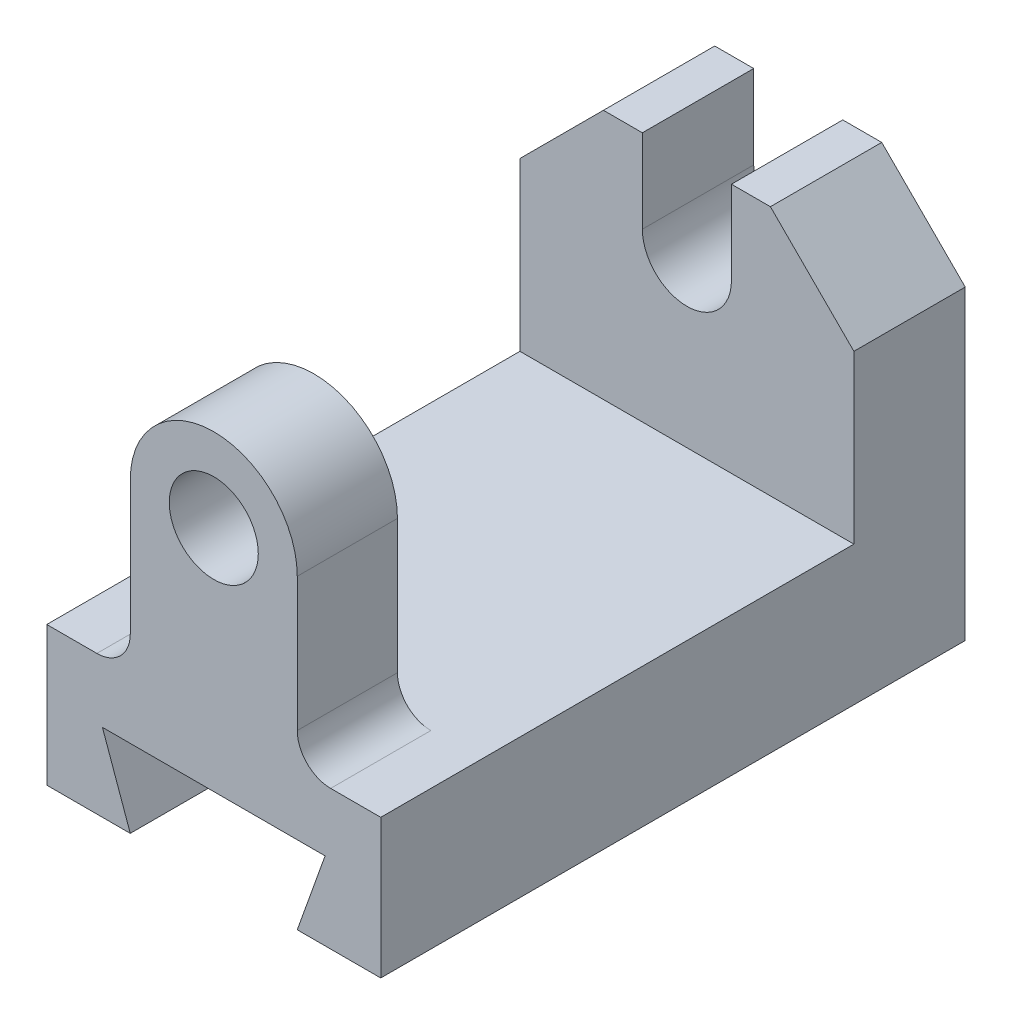
ISO-10303-21;
HEADER;
FILE_DESCRIPTION(('STEP AP214'),'2;1');
FILE_NAME('part.step','',(''),(''),'','','');
FILE_SCHEMA(('AUTOMOTIVE_DESIGN { 1 0 10303 214 1 1 1 1 }'));
ENDSEC;
DATA;
#1=APPLICATION_CONTEXT('core data for automotive mechanical design processes');
#2=APPLICATION_PROTOCOL_DEFINITION('international standard','automotive_design',2000,#1);
#3=PRODUCT_CONTEXT('',#1,'mechanical');
#4=PRODUCT('Part','Part','',(#3));
#5=PRODUCT_RELATED_PRODUCT_CATEGORY('part','',(#4));
#6=PRODUCT_DEFINITION_FORMATION('','',#4);
#7=PRODUCT_DEFINITION_CONTEXT('part definition',#1,'design');
#8=PRODUCT_DEFINITION('design','',#6,#7);
#9=PRODUCT_DEFINITION_SHAPE('','',#8);
#10=(LENGTH_UNIT() NAMED_UNIT(*) SI_UNIT(.MILLI.,.METRE.));
#11=(NAMED_UNIT(*) PLANE_ANGLE_UNIT() SI_UNIT($,.RADIAN.));
#12=(NAMED_UNIT(*) SI_UNIT($,.STERADIAN.) SOLID_ANGLE_UNIT());
#13=UNCERTAINTY_MEASURE_WITH_UNIT(LENGTH_MEASURE(1.E-05),#10,'distance_accuracy_value','');
#14=(GEOMETRIC_REPRESENTATION_CONTEXT(3) GLOBAL_UNCERTAINTY_ASSIGNED_CONTEXT((#13)) GLOBAL_UNIT_ASSIGNED_CONTEXT((#10,
#11,#12)) REPRESENTATION_CONTEXT('',''));
#15=CARTESIAN_POINT('',(0.,0.,0.));
#16=DIRECTION('',(0.,0.,1.));
#17=DIRECTION('',(1.,0.,0.));
#18=AXIS2_PLACEMENT_3D('',#15,#16,#17);
#19=CARTESIAN_POINT('',(0.,25.,-105.));
#20=DIRECTION('',(0.,1.,0.));
#21=DIRECTION('',(0.,0.,1.));
#22=AXIS2_PLACEMENT_3D('',#19,#20,#21);
#23=PLANE('',#22);
#24=DIRECTION('',(0.,0.,1.));
#25=VECTOR('',#24,1.);
#26=CARTESIAN_POINT('',(60.,25.,-105.));
#27=LINE('',#26,#25);
#28=CARTESIAN_POINT('',(60.,25.,-85.));
#29=VERTEX_POINT('',#28);
#30=CARTESIAN_POINT('',(60.,25.,0.));
#31=VERTEX_POINT('',#30);
#32=EDGE_CURVE('E55',#29,#31,#27,.T.);
#33=ORIENTED_EDGE('',*,*,#32,.F.);
#34=DIRECTION('',(-1.,0.,0.));
#35=VECTOR('',#34,1.);
#36=CARTESIAN_POINT('',(60.,25.,-85.));
#37=LINE('',#36,#35);
#38=CARTESIAN_POINT('',(0.,25.,-85.));
#39=VERTEX_POINT('',#38);
#40=EDGE_CURVE('E50',#29,#39,#37,.T.);
#41=ORIENTED_EDGE('',*,*,#40,.T.);
#42=DIRECTION('',(0.,0.,1.));
#43=VECTOR('',#42,1.);
#44=CARTESIAN_POINT('',(0.,25.,-105.));
#45=LINE('',#44,#43);
#46=CARTESIAN_POINT('',(0.,25.,0.));
#47=VERTEX_POINT('',#46);
#48=EDGE_CURVE('E207',#39,#47,#45,.T.);
#49=ORIENTED_EDGE('',*,*,#48,.T.);
#50=DIRECTION('',(-1.,0.,0.));
#51=VECTOR('',#50,1.);
#52=CARTESIAN_POINT('',(0.,25.,0.));
#53=LINE('',#52,#51);
#54=CARTESIAN_POINT('',(9.,25.,0.));
#55=VERTEX_POINT('',#54);
#56=EDGE_CURVE('E332',#55,#47,#53,.T.);
#57=ORIENTED_EDGE('',*,*,#56,.F.);
#58=DIRECTION('',(0.,0.,1.));
#59=VECTOR('',#58,1.);
#60=CARTESIAN_POINT('',(9.,25.,-18.));
#61=LINE('',#60,#59);
#62=CARTESIAN_POINT('',(9.00000000000001,25.,-18.));
#63=VERTEX_POINT('',#62);
#64=EDGE_CURVE('E354',#55,#63,#61,.F.);
#65=ORIENTED_EDGE('',*,*,#64,.T.);
#66=DIRECTION('',(1.,0.,0.));
#67=VECTOR('',#66,1.);
#68=CARTESIAN_POINT('',(15.,25.,-18.));
#69=LINE('',#68,#67);
#70=CARTESIAN_POINT('',(51.,25.,-18.));
#71=VERTEX_POINT('',#70);
#72=EDGE_CURVE('E275',#63,#71,#69,.T.);
#73=ORIENTED_EDGE('',*,*,#72,.T.);
#74=DIRECTION('',(0.,0.,1.));
#75=VECTOR('',#74,1.);
#76=CARTESIAN_POINT('',(51.,25.,0.));
#77=LINE('',#76,#75);
#78=CARTESIAN_POINT('',(51.,25.,0.));
#79=VERTEX_POINT('',#78);
#80=EDGE_CURVE('E351',#71,#79,#77,.T.);
#81=ORIENTED_EDGE('',*,*,#80,.T.);
#82=EDGE_CURVE('E294',#31,#79,#53,.T.);
#83=ORIENTED_EDGE('',*,*,#82,.F.);
#84=EDGE_LOOP('',(#33,#41,#49,#57,#65,#73,#81,#83));
#85=FACE_BOUND('',#84,.T.);
#86=ADVANCED_FACE('F35',(#85),#23,.T.);
#87=CARTESIAN_POINT('',(0.,0.,-105.));
#88=DIRECTION('',(-1.,0.,0.));
#89=DIRECTION('',(0.,0.,1.));
#90=AXIS2_PLACEMENT_3D('',#87,#88,#89);
#91=PLANE('',#90);
#92=DIRECTION('',(0.,-1.,0.));
#93=VECTOR('',#92,1.);
#94=CARTESIAN_POINT('',(0.,0.,0.));
#95=LINE('',#94,#93);
#96=CARTESIAN_POINT('',(0.,0.,0.));
#97=VERTEX_POINT('',#96);
#98=EDGE_CURVE('E289',#47,#97,#95,.T.);
#99=ORIENTED_EDGE('',*,*,#98,.F.);
#100=ORIENTED_EDGE('',*,*,#48,.F.);
#101=DIRECTION('',(0.,1.,0.));
#102=VECTOR('',#101,1.);
#103=CARTESIAN_POINT('',(0.,25.,-85.));
#104=LINE('',#103,#102);
#105=CARTESIAN_POINT('',(0.,55.0000000000001,-85.));
#106=VERTEX_POINT('',#105);
#107=EDGE_CURVE('E200',#39,#106,#104,.T.);
#108=ORIENTED_EDGE('',*,*,#107,.T.);
#109=DIRECTION('',(0.,0.,-1.));
#110=VECTOR('',#109,1.);
#111=CARTESIAN_POINT('',(0.,55.0000000000001,-85.));
#112=LINE('',#111,#110);
#113=CARTESIAN_POINT('',(0.,55.0000000000001,-105.));
#114=VERTEX_POINT('',#113);
#115=EDGE_CURVE('E183',#106,#114,#112,.T.);
#116=ORIENTED_EDGE('',*,*,#115,.T.);
#117=DIRECTION('',(0.,-1.,0.));
#118=VECTOR('',#117,1.);
#119=CARTESIAN_POINT('',(0.,0.,-105.));
#120=LINE('',#119,#118);
#121=CARTESIAN_POINT('',(0.,0.,-105.));
#122=VERTEX_POINT('',#121);
#123=EDGE_CURVE('E291',#114,#122,#120,.T.);
#124=ORIENTED_EDGE('',*,*,#123,.T.);
#125=DIRECTION('',(0.,0.,1.));
#126=VECTOR('',#125,1.);
#127=CARTESIAN_POINT('',(0.,0.,-105.));
#128=LINE('',#127,#126);
#129=EDGE_CURVE('E311',#122,#97,#128,.T.);
#130=ORIENTED_EDGE('',*,*,#129,.T.);
#131=EDGE_LOOP('',(#99,#100,#108,#116,#124,#130));
#132=FACE_BOUND('',#131,.T.);
#133=ADVANCED_FACE('F206',(#132),#91,.T.);
#134=CARTESIAN_POINT('',(60.,0.,-105.));
#135=DIRECTION('',(1.,0.,0.));
#136=DIRECTION('',(0.,0.,-1.));
#137=AXIS2_PLACEMENT_3D('',#134,#135,#136);
#138=PLANE('',#137);
#139=DIRECTION('',(0.,1.,0.));
#140=VECTOR('',#139,1.);
#141=CARTESIAN_POINT('',(60.,0.,0.));
#142=LINE('',#141,#140);
#143=CARTESIAN_POINT('',(60.,0.,0.));
#144=VERTEX_POINT('',#143);
#145=EDGE_CURVE('E329',#144,#31,#142,.T.);
#146=ORIENTED_EDGE('',*,*,#145,.F.);
#147=DIRECTION('',(0.,0.,1.));
#148=VECTOR('',#147,1.);
#149=CARTESIAN_POINT('',(60.,0.,-105.));
#150=LINE('',#149,#148);
#151=CARTESIAN_POINT('',(60.,0.,-105.));
#152=VERTEX_POINT('',#151);
#153=EDGE_CURVE('E338',#152,#144,#150,.T.);
#154=ORIENTED_EDGE('',*,*,#153,.F.);
#155=DIRECTION('',(0.,1.,0.));
#156=VECTOR('',#155,1.);
#157=CARTESIAN_POINT('',(60.,0.,-105.));
#158=LINE('',#157,#156);
#159=CARTESIAN_POINT('',(60.,55.0000000000001,-105.));
#160=VERTEX_POINT('',#159);
#161=EDGE_CURVE('E309',#152,#160,#158,.T.);
#162=ORIENTED_EDGE('',*,*,#161,.T.);
#163=DIRECTION('',(0.,0.,-1.));
#164=VECTOR('',#163,1.);
#165=CARTESIAN_POINT('',(60.,55.0000000000001,-85.));
#166=LINE('',#165,#164);
#167=CARTESIAN_POINT('',(60.,55.0000000000001,-85.));
#168=VERTEX_POINT('',#167);
#169=EDGE_CURVE('E247',#168,#160,#166,.T.);
#170=ORIENTED_EDGE('',*,*,#169,.F.);
#171=DIRECTION('',(0.,-1.,0.));
#172=VECTOR('',#171,1.);
#173=CARTESIAN_POINT('',(60.,25.,-85.));
#174=LINE('',#173,#172);
#175=EDGE_CURVE('E209',#168,#29,#174,.T.);
#176=ORIENTED_EDGE('',*,*,#175,.T.);
#177=ORIENTED_EDGE('',*,*,#32,.T.);
#178=EDGE_LOOP('',(#146,#154,#162,#170,#176,#177));
#179=FACE_BOUND('',#178,.T.);
#180=ADVANCED_FACE('F414',(#179),#138,.T.);
#181=CARTESIAN_POINT('',(45.,0.,-105.));
#182=DIRECTION('',(0.,-1.,0.));
#183=DIRECTION('',(0.,0.,-1.));
#184=AXIS2_PLACEMENT_3D('',#181,#182,#183);
#185=PLANE('',#184);
#186=DIRECTION('',(1.,0.,0.));
#187=VECTOR('',#186,1.);
#188=CARTESIAN_POINT('',(45.,0.,0.));
#189=LINE('',#188,#187);
#190=CARTESIAN_POINT('',(45.,0.,0.));
#191=VERTEX_POINT('',#190);
#192=EDGE_CURVE('E326',#191,#144,#189,.T.);
#193=ORIENTED_EDGE('',*,*,#192,.F.);
#194=DIRECTION('',(0.,0.,1.));
#195=VECTOR('',#194,1.);
#196=CARTESIAN_POINT('',(45.,0.,-105.));
#197=LINE('',#196,#195);
#198=CARTESIAN_POINT('',(45.,0.,-105.));
#199=VERTEX_POINT('',#198);
#200=EDGE_CURVE('E340',#199,#191,#197,.T.);
#201=ORIENTED_EDGE('',*,*,#200,.F.);
#202=DIRECTION('',(1.,0.,0.));
#203=VECTOR('',#202,1.);
#204=CARTESIAN_POINT('',(45.,0.,-105.));
#205=LINE('',#204,#203);
#206=EDGE_CURVE('E306',#199,#152,#205,.T.);
#207=ORIENTED_EDGE('',*,*,#206,.T.);
#208=ORIENTED_EDGE('',*,*,#153,.T.);
#209=EDGE_LOOP('',(#193,#201,#207,#208));
#210=FACE_BOUND('',#209,.T.);
#211=ADVANCED_FACE('F410',(#210),#185,.T.);
#212=CARTESIAN_POINT('',(50.,14.,-105.));
#213=DIRECTION('',(-0.941741911594837,0.336336396998156,0.));
#214=DIRECTION('',(-0.336336396998157,-0.941741911594838,0.));
#215=AXIS2_PLACEMENT_3D('',#212,#213,#214);
#216=PLANE('',#215);
#217=DIRECTION('',(-0.336336396998156,-0.941741911594837,0.));
#218=VECTOR('',#217,1.);
#219=CARTESIAN_POINT('',(50.,14.,0.));
#220=LINE('',#219,#218);
#221=CARTESIAN_POINT('',(50.,14.,0.));
#222=VERTEX_POINT('',#221);
#223=EDGE_CURVE('E323',#222,#191,#220,.T.);
#224=ORIENTED_EDGE('',*,*,#223,.F.);
#225=DIRECTION('',(0.,0.,1.));
#226=VECTOR('',#225,1.);
#227=CARTESIAN_POINT('',(50.,14.,-105.));
#228=LINE('',#227,#226);
#229=CARTESIAN_POINT('',(50.,14.,-105.));
#230=VERTEX_POINT('',#229);
#231=EDGE_CURVE('E342',#230,#222,#228,.T.);
#232=ORIENTED_EDGE('',*,*,#231,.F.);
#233=DIRECTION('',(-0.336336396998156,-0.941741911594837,0.));
#234=VECTOR('',#233,1.);
#235=CARTESIAN_POINT('',(50.,14.,-105.));
#236=LINE('',#235,#234);
#237=EDGE_CURVE('E303',#230,#199,#236,.T.);
#238=ORIENTED_EDGE('',*,*,#237,.T.);
#239=ORIENTED_EDGE('',*,*,#200,.T.);
#240=EDGE_LOOP('',(#224,#232,#238,#239));
#241=FACE_BOUND('',#240,.T.);
#242=ADVANCED_FACE('F406',(#241),#216,.T.);
#243=CARTESIAN_POINT('',(9.99999999999999,14.,-105.));
#244=DIRECTION('',(0.,-1.,0.));
#245=DIRECTION('',(0.,0.,-1.));
#246=AXIS2_PLACEMENT_3D('',#243,#244,#245);
#247=PLANE('',#246);
#248=DIRECTION('',(1.,0.,0.));
#249=VECTOR('',#248,1.);
#250=CARTESIAN_POINT('',(9.99999999999999,14.,0.));
#251=LINE('',#250,#249);
#252=CARTESIAN_POINT('',(9.99999999999999,14.,0.));
#253=VERTEX_POINT('',#252);
#254=EDGE_CURVE('E320',#253,#222,#251,.T.);
#255=ORIENTED_EDGE('',*,*,#254,.F.);
#256=DIRECTION('',(0.,0.,1.));
#257=VECTOR('',#256,1.);
#258=CARTESIAN_POINT('',(9.99999999999999,14.,-105.));
#259=LINE('',#258,#257);
#260=CARTESIAN_POINT('',(9.99999999999999,14.,-105.));
#261=VERTEX_POINT('',#260);
#262=EDGE_CURVE('E344',#261,#253,#259,.T.);
#263=ORIENTED_EDGE('',*,*,#262,.F.);
#264=DIRECTION('',(1.,0.,0.));
#265=VECTOR('',#264,1.);
#266=CARTESIAN_POINT('',(9.99999999999999,14.,-105.));
#267=LINE('',#266,#265);
#268=EDGE_CURVE('E300',#261,#230,#267,.T.);
#269=ORIENTED_EDGE('',*,*,#268,.T.);
#270=ORIENTED_EDGE('',*,*,#231,.T.);
#271=EDGE_LOOP('',(#255,#263,#269,#270));
#272=FACE_BOUND('',#271,.T.);
#273=ADVANCED_FACE('F402',(#272),#247,.T.);
#274=CARTESIAN_POINT('',(15.,0.,-105.));
#275=DIRECTION('',(0.941741911594837,0.336336396998156,0.));
#276=DIRECTION('',(-0.336336396998157,0.941741911594838,0.));
#277=AXIS2_PLACEMENT_3D('',#274,#275,#276);
#278=PLANE('',#277);
#279=DIRECTION('',(-0.336336396998156,0.941741911594837,0.));
#280=VECTOR('',#279,1.);
#281=CARTESIAN_POINT('',(15.,0.,0.));
#282=LINE('',#281,#280);
#283=CARTESIAN_POINT('',(15.,0.,0.));
#284=VERTEX_POINT('',#283);
#285=EDGE_CURVE('E317',#284,#253,#282,.T.);
#286=ORIENTED_EDGE('',*,*,#285,.F.);
#287=DIRECTION('',(0.,0.,1.));
#288=VECTOR('',#287,1.);
#289=CARTESIAN_POINT('',(15.,0.,-105.));
#290=LINE('',#289,#288);
#291=CARTESIAN_POINT('',(15.,0.,-105.));
#292=VERTEX_POINT('',#291);
#293=EDGE_CURVE('E346',#292,#284,#290,.T.);
#294=ORIENTED_EDGE('',*,*,#293,.F.);
#295=DIRECTION('',(-0.336336396998156,0.941741911594837,0.));
#296=VECTOR('',#295,1.);
#297=CARTESIAN_POINT('',(15.,0.,-105.));
#298=LINE('',#297,#296);
#299=EDGE_CURVE('E297',#292,#261,#298,.T.);
#300=ORIENTED_EDGE('',*,*,#299,.T.);
#301=ORIENTED_EDGE('',*,*,#262,.T.);
#302=EDGE_LOOP('',(#286,#294,#300,#301));
#303=FACE_BOUND('',#302,.T.);
#304=ADVANCED_FACE('F398',(#303),#278,.T.);
#305=CARTESIAN_POINT('',(0.,0.,-105.));
#306=DIRECTION('',(0.,-1.,0.));
#307=DIRECTION('',(0.,0.,-1.));
#308=AXIS2_PLACEMENT_3D('',#305,#306,#307);
#309=PLANE('',#308);
#310=DIRECTION('',(1.,0.,0.));
#311=VECTOR('',#310,1.);
#312=CARTESIAN_POINT('',(0.,0.,0.));
#313=LINE('',#312,#311);
#314=EDGE_CURVE('E314',#97,#284,#313,.T.);
#315=ORIENTED_EDGE('',*,*,#314,.F.);
#316=ORIENTED_EDGE('',*,*,#129,.F.);
#317=DIRECTION('',(1.,0.,0.));
#318=VECTOR('',#317,1.);
#319=CARTESIAN_POINT('',(0.,0.,-105.));
#320=LINE('',#319,#318);
#321=EDGE_CURVE('E293',#122,#292,#320,.T.);
#322=ORIENTED_EDGE('',*,*,#321,.T.);
#323=ORIENTED_EDGE('',*,*,#293,.T.);
#324=EDGE_LOOP('',(#315,#316,#322,#323));
#325=FACE_BOUND('',#324,.T.);
#326=ADVANCED_FACE('F394',(#325),#309,.T.);
#327=CARTESIAN_POINT('',(0.,0.,-105.));
#328=DIRECTION('',(0.,0.,-1.));
#329=DIRECTION('',(-1.,0.,0.));
#330=AXIS2_PLACEMENT_3D('',#327,#328,#329);
#331=PLANE('',#330);
#332=ORIENTED_EDGE('',*,*,#123,.F.);
#333=DIRECTION('',(0.707106781186549,0.707106781186546,0.));
#334=VECTOR('',#333,1.);
#335=CARTESIAN_POINT('',(15.,70.,-105.));
#336=LINE('',#335,#334);
#337=CARTESIAN_POINT('',(15.,70.,-105.));
#338=VERTEX_POINT('',#337);
#339=EDGE_CURVE('E188',#114,#338,#336,.T.);
#340=ORIENTED_EDGE('',*,*,#339,.T.);
#341=DIRECTION('',(1.,0.,0.));
#342=VECTOR('',#341,1.);
#343=CARTESIAN_POINT('',(22.,70.,-105.));
#344=LINE('',#343,#342);
#345=CARTESIAN_POINT('',(22.,70.,-105.));
#346=VERTEX_POINT('',#345);
#347=EDGE_CURVE('E229',#338,#346,#344,.T.);
#348=ORIENTED_EDGE('',*,*,#347,.T.);
#349=DIRECTION('',(0.,-1.,0.));
#350=VECTOR('',#349,1.);
#351=CARTESIAN_POINT('',(22.,55.,-105.));
#352=LINE('',#351,#350);
#353=CARTESIAN_POINT('',(22.,55.,-105.));
#354=VERTEX_POINT('',#353);
#355=EDGE_CURVE('E232',#346,#354,#352,.T.);
#356=ORIENTED_EDGE('',*,*,#355,.T.);
#357=CARTESIAN_POINT('',(30.,55.,-105.));
#358=DIRECTION('',(0.,0.,1.));
#359=DIRECTION('',(-1.,0.,0.));
#360=AXIS2_PLACEMENT_3D('',#357,#358,#359);
#361=CIRCLE('',#360,8.);
#362=CARTESIAN_POINT('',(38.,55.,-105.));
#363=VERTEX_POINT('',#362);
#364=EDGE_CURVE('E235',#354,#363,#361,.T.);
#365=ORIENTED_EDGE('',*,*,#364,.T.);
#366=DIRECTION('',(0.,1.,0.));
#367=VECTOR('',#366,1.);
#368=CARTESIAN_POINT('',(38.,55.,-105.));
#369=LINE('',#368,#367);
#370=CARTESIAN_POINT('',(38.,70.,-105.));
#371=VERTEX_POINT('',#370);
#372=EDGE_CURVE('E238',#363,#371,#369,.T.);
#373=ORIENTED_EDGE('',*,*,#372,.T.);
#374=DIRECTION('',(1.,0.,0.));
#375=VECTOR('',#374,1.);
#376=CARTESIAN_POINT('',(45.,70.,-105.));
#377=LINE('',#376,#375);
#378=CARTESIAN_POINT('',(45.,70.,-105.));
#379=VERTEX_POINT('',#378);
#380=EDGE_CURVE('E241',#371,#379,#377,.T.);
#381=ORIENTED_EDGE('',*,*,#380,.T.);
#382=DIRECTION('',(0.707106781186548,-0.707106781186547,0.));
#383=VECTOR('',#382,1.);
#384=CARTESIAN_POINT('',(60.,55.0000000000001,-105.));
#385=LINE('',#384,#383);
#386=EDGE_CURVE('E244',#379,#160,#385,.T.);
#387=ORIENTED_EDGE('',*,*,#386,.T.);
#388=ORIENTED_EDGE('',*,*,#161,.F.);
#389=ORIENTED_EDGE('',*,*,#206,.F.);
#390=ORIENTED_EDGE('',*,*,#237,.F.);
#391=ORIENTED_EDGE('',*,*,#268,.F.);
#392=ORIENTED_EDGE('',*,*,#299,.F.);
#393=ORIENTED_EDGE('',*,*,#321,.F.);
#394=EDGE_LOOP('',(#332,#340,#348,#356,#365,#373,#381,#387,#388,#389,#390,#391,#392,#393));
#395=FACE_BOUND('',#394,.T.);
#396=ADVANCED_FACE('F439',(#395),#331,.T.);
#397=CARTESIAN_POINT('',(0.,0.,0.));
#398=DIRECTION('',(0.,0.,-1.));
#399=DIRECTION('',(-1.,0.,0.));
#400=AXIS2_PLACEMENT_3D('',#397,#398,#399);
#401=PLANE('',#400);
#402=ORIENTED_EDGE('',*,*,#98,.T.);
#403=ORIENTED_EDGE('',*,*,#314,.T.);
#404=ORIENTED_EDGE('',*,*,#285,.T.);
#405=ORIENTED_EDGE('',*,*,#254,.T.);
#406=ORIENTED_EDGE('',*,*,#223,.T.);
#407=ORIENTED_EDGE('',*,*,#192,.T.);
#408=ORIENTED_EDGE('',*,*,#145,.T.);
#409=ORIENTED_EDGE('',*,*,#82,.T.);
#410=CARTESIAN_POINT('',(51.,31.,0.));
#411=DIRECTION('',(0.,0.,-1.));
#412=DIRECTION('',(-1.,0.,0.));
#413=AXIS2_PLACEMENT_3D('',#410,#411,#412);
#414=CIRCLE('',#413,6.);
#415=CARTESIAN_POINT('',(45.,31.,0.));
#416=VERTEX_POINT('',#415);
#417=EDGE_CURVE('E43',#79,#416,#414,.T.);
#418=ORIENTED_EDGE('',*,*,#417,.T.);
#419=DIRECTION('',(0.,1.,0.));
#420=VECTOR('',#419,1.);
#421=CARTESIAN_POINT('',(45.,55.,0.));
#422=LINE('',#421,#420);
#423=CARTESIAN_POINT('',(45.,55.,0.));
#424=VERTEX_POINT('',#423);
#425=EDGE_CURVE('E272',#416,#424,#422,.T.);
#426=ORIENTED_EDGE('',*,*,#425,.T.);
#427=CARTESIAN_POINT('',(30.,55.,0.));
#428=DIRECTION('',(0.,0.,1.));
#429=DIRECTION('',(1.,0.,0.));
#430=AXIS2_PLACEMENT_3D('',#427,#428,#429);
#431=CIRCLE('',#430,15.);
#432=CARTESIAN_POINT('',(15.,55.,0.));
#433=VERTEX_POINT('',#432);
#434=EDGE_CURVE('E265',#424,#433,#431,.T.);
#435=ORIENTED_EDGE('',*,*,#434,.T.);
#436=DIRECTION('',(0.,-1.,0.));
#437=VECTOR('',#436,1.);
#438=CARTESIAN_POINT('',(15.,55.,0.));
#439=LINE('',#438,#437);
#440=CARTESIAN_POINT('',(15.,31.,0.));
#441=VERTEX_POINT('',#440);
#442=EDGE_CURVE('E282',#433,#441,#439,.T.);
#443=ORIENTED_EDGE('',*,*,#442,.T.);
#444=CARTESIAN_POINT('',(9.,31.,0.));
#445=DIRECTION('',(0.,0.,-1.));
#446=DIRECTION('',(-1.,0.,0.));
#447=AXIS2_PLACEMENT_3D('',#444,#445,#446);
#448=CIRCLE('',#447,6.);
#449=EDGE_CURVE('E359',#441,#55,#448,.T.);
#450=ORIENTED_EDGE('',*,*,#449,.T.);
#451=ORIENTED_EDGE('',*,*,#56,.T.);
#452=EDGE_LOOP('',(#402,#403,#404,#405,#406,#407,#408,#409,#418,#426,#435,#443,#450,#451));
#453=FACE_BOUND('',#452,.T.);
#454=CARTESIAN_POINT('',(30.,55.,0.));
#455=DIRECTION('',(0.,0.,1.));
#456=DIRECTION('',(1.,0.,0.));
#457=AXIS2_PLACEMENT_3D('',#454,#455,#456);
#458=CIRCLE('',#457,8.);
#459=CARTESIAN_POINT('',(38.,55.,0.));
#460=VERTEX_POINT('',#459);
#461=EDGE_CURVE('E250',#460,#460,#458,.T.);
#462=ORIENTED_EDGE('',*,*,#461,.F.);
#463=EDGE_LOOP('',(#462));
#464=FACE_BOUND('',#463,.T.);
#465=ADVANCED_FACE('F364',(#453,#464),#401,.F.);
#466=CARTESIAN_POINT('',(30.,55.,-18.));
#467=DIRECTION('',(0.,0.,1.));
#468=DIRECTION('',(1.,0.,0.));
#469=AXIS2_PLACEMENT_3D('',#466,#467,#468);
#470=CYLINDRICAL_SURFACE('',#469,15.);
#471=ORIENTED_EDGE('',*,*,#434,.F.);
#472=DIRECTION('',(0.,0.,1.));
#473=VECTOR('',#472,1.);
#474=CARTESIAN_POINT('',(45.,55.,-18.));
#475=LINE('',#474,#473);
#476=CARTESIAN_POINT('',(45.,55.,-18.));
#477=VERTEX_POINT('',#476);
#478=EDGE_CURVE('E286',#477,#424,#475,.T.);
#479=ORIENTED_EDGE('',*,*,#478,.F.);
#480=CARTESIAN_POINT('',(30.,55.,-18.));
#481=DIRECTION('',(0.,0.,1.));
#482=DIRECTION('',(1.,0.,0.));
#483=AXIS2_PLACEMENT_3D('',#480,#481,#482);
#484=CIRCLE('',#483,15.);
#485=CARTESIAN_POINT('',(15.,55.,-18.));
#486=VERTEX_POINT('',#485);
#487=EDGE_CURVE('E268',#477,#486,#484,.T.);
#488=ORIENTED_EDGE('',*,*,#487,.T.);
#489=DIRECTION('',(0.,0.,1.));
#490=VECTOR('',#489,1.);
#491=CARTESIAN_POINT('',(15.,55.,-18.));
#492=LINE('',#491,#490);
#493=EDGE_CURVE('E279',#486,#433,#492,.T.);
#494=ORIENTED_EDGE('',*,*,#493,.T.);
#495=EDGE_LOOP('',(#471,#479,#488,#494));
#496=FACE_BOUND('',#495,.T.);
#497=ADVANCED_FACE('F380',(#496),#470,.T.);
#498=CARTESIAN_POINT('',(45.,55.,-18.));
#499=DIRECTION('',(1.,0.,0.));
#500=DIRECTION('',(0.,1.,0.));
#501=AXIS2_PLACEMENT_3D('',#498,#499,#500);
#502=PLANE('',#501);
#503=ORIENTED_EDGE('',*,*,#425,.F.);
#504=DIRECTION('',(0.,0.,1.));
#505=VECTOR('',#504,1.);
#506=CARTESIAN_POINT('',(45.,31.,-18.));
#507=LINE('',#506,#505);
#508=CARTESIAN_POINT('',(45.,31.,-18.));
#509=VERTEX_POINT('',#508);
#510=EDGE_CURVE('E357',#416,#509,#507,.F.);
#511=ORIENTED_EDGE('',*,*,#510,.T.);
#512=DIRECTION('',(0.,1.,0.));
#513=VECTOR('',#512,1.);
#514=CARTESIAN_POINT('',(45.,55.,-18.));
#515=LINE('',#514,#513);
#516=EDGE_CURVE('E277',#509,#477,#515,.T.);
#517=ORIENTED_EDGE('',*,*,#516,.T.);
#518=ORIENTED_EDGE('',*,*,#478,.T.);
#519=EDGE_LOOP('',(#503,#511,#517,#518));
#520=FACE_BOUND('',#519,.T.);
#521=ADVANCED_FACE('F370',(#520),#502,.T.);
#522=CARTESIAN_POINT('',(15.,55.,-18.));
#523=DIRECTION('',(-1.,0.,0.));
#524=DIRECTION('',(0.,-1.,0.));
#525=AXIS2_PLACEMENT_3D('',#522,#523,#524);
#526=PLANE('',#525);
#527=DIRECTION('',(0.,-1.,0.));
#528=VECTOR('',#527,1.);
#529=CARTESIAN_POINT('',(15.,55.,-18.));
#530=LINE('',#529,#528);
#531=CARTESIAN_POINT('',(15.,31.,-18.));
#532=VERTEX_POINT('',#531);
#533=EDGE_CURVE('E271',#486,#532,#530,.T.);
#534=ORIENTED_EDGE('',*,*,#533,.T.);
#535=DIRECTION('',(0.,0.,1.));
#536=VECTOR('',#535,1.);
#537=CARTESIAN_POINT('',(15.,31.,0.));
#538=LINE('',#537,#536);
#539=EDGE_CURVE('E336',#532,#441,#538,.T.);
#540=ORIENTED_EDGE('',*,*,#539,.T.);
#541=ORIENTED_EDGE('',*,*,#442,.F.);
#542=ORIENTED_EDGE('',*,*,#493,.F.);
#543=EDGE_LOOP('',(#534,#540,#541,#542));
#544=FACE_BOUND('',#543,.T.);
#545=ADVANCED_FACE('F385',(#544),#526,.T.);
#546=CARTESIAN_POINT('',(30.,55.,-18.));
#547=DIRECTION('',(0.,0.,1.));
#548=DIRECTION('',(1.,0.,0.));
#549=AXIS2_PLACEMENT_3D('',#546,#547,#548);
#550=PLANE('',#549);
#551=CARTESIAN_POINT('',(30.,55.,-18.));
#552=DIRECTION('',(0.,0.,1.));
#553=DIRECTION('',(1.,0.,0.));
#554=AXIS2_PLACEMENT_3D('',#551,#552,#553);
#555=CIRCLE('',#554,8.);
#556=CARTESIAN_POINT('',(38.,55.,-18.));
#557=VERTEX_POINT('',#556);
#558=EDGE_CURVE('E262',#557,#557,#555,.T.);
#559=ORIENTED_EDGE('',*,*,#558,.T.);
#560=EDGE_LOOP('',(#559));
#561=FACE_BOUND('',#560,.T.);
#562=ORIENTED_EDGE('',*,*,#487,.F.);
#563=ORIENTED_EDGE('',*,*,#516,.F.);
#564=CARTESIAN_POINT('',(51.,31.,-18.));
#565=DIRECTION('',(0.,0.,1.));
#566=DIRECTION('',(1.,0.,0.));
#567=AXIS2_PLACEMENT_3D('',#564,#565,#566);
#568=CIRCLE('',#567,6.);
#569=EDGE_CURVE('E11',#509,#71,#568,.T.);
#570=ORIENTED_EDGE('',*,*,#569,.T.);
#571=ORIENTED_EDGE('',*,*,#72,.F.);
#572=CARTESIAN_POINT('',(9.,31.,-18.));
#573=DIRECTION('',(0.,0.,1.));
#574=DIRECTION('',(1.,0.,0.));
#575=AXIS2_PLACEMENT_3D('',#572,#573,#574);
#576=CIRCLE('',#575,6.);
#577=EDGE_CURVE('E361',#63,#532,#576,.T.);
#578=ORIENTED_EDGE('',*,*,#577,.T.);
#579=ORIENTED_EDGE('',*,*,#533,.F.);
#580=EDGE_LOOP('',(#562,#563,#570,#571,#578,#579));
#581=FACE_BOUND('',#580,.T.);
#582=ADVANCED_FACE('F377',(#561,#581),#550,.F.);
#583=CARTESIAN_POINT('',(30.,55.,-18.));
#584=DIRECTION('',(0.,0.,1.));
#585=DIRECTION('',(1.,0.,0.));
#586=AXIS2_PLACEMENT_3D('',#583,#584,#585);
#587=CYLINDRICAL_SURFACE('',#586,8.);
#588=ORIENTED_EDGE('',*,*,#558,.F.);
#589=EDGE_LOOP('',(#588));
#590=FACE_BOUND('',#589,.T.);
#591=ORIENTED_EDGE('',*,*,#461,.T.);
#592=EDGE_LOOP('',(#591));
#593=FACE_BOUND('',#592,.T.);
#594=ADVANCED_FACE('F466',(#590,#593),#587,.F.);
#595=CARTESIAN_POINT('',(9.,31.,-18.));
#596=DIRECTION('',(0.,0.,-1.));
#597=DIRECTION('',(-1.,0.,0.));
#598=AXIS2_PLACEMENT_3D('',#595,#596,#597);
#599=CYLINDRICAL_SURFACE('',#598,6.);
#600=ORIENTED_EDGE('',*,*,#577,.F.);
#601=ORIENTED_EDGE('',*,*,#64,.F.);
#602=ORIENTED_EDGE('',*,*,#449,.F.);
#603=ORIENTED_EDGE('',*,*,#539,.F.);
#604=EDGE_LOOP('',(#600,#601,#602,#603));
#605=FACE_BOUND('',#604,.T.);
#606=ADVANCED_FACE('F389',(#605),#599,.F.);
#607=CARTESIAN_POINT('',(51.,31.,-105.));
#608=DIRECTION('',(0.,0.,-1.));
#609=DIRECTION('',(-1.,0.,0.));
#610=AXIS2_PLACEMENT_3D('',#607,#608,#609);
#611=CYLINDRICAL_SURFACE('',#610,6.);
#612=ORIENTED_EDGE('',*,*,#569,.F.);
#613=ORIENTED_EDGE('',*,*,#510,.F.);
#614=ORIENTED_EDGE('',*,*,#417,.F.);
#615=ORIENTED_EDGE('',*,*,#80,.F.);
#616=EDGE_LOOP('',(#612,#613,#614,#615));
#617=FACE_BOUND('',#616,.T.);
#618=ADVANCED_FACE('F37',(#617),#611,.F.);
#619=CARTESIAN_POINT('',(60.,55.0000000000001,-85.));
#620=DIRECTION('',(0.707106781186547,0.707106781186548,0.));
#621=DIRECTION('',(-0.707106781186548,0.707106781186547,0.));
#622=AXIS2_PLACEMENT_3D('',#619,#620,#621);
#623=PLANE('',#622);
#624=ORIENTED_EDGE('',*,*,#386,.F.);
#625=DIRECTION('',(0.,0.,-1.));
#626=VECTOR('',#625,1.);
#627=CARTESIAN_POINT('',(45.,70.,-85.));
#628=LINE('',#627,#626);
#629=CARTESIAN_POINT('',(45.,70.,-85.));
#630=VERTEX_POINT('',#629);
#631=EDGE_CURVE('E251',#630,#379,#628,.T.);
#632=ORIENTED_EDGE('',*,*,#631,.F.);
#633=DIRECTION('',(0.707106781186548,-0.707106781186547,0.));
#634=VECTOR('',#633,1.);
#635=CARTESIAN_POINT('',(60.,55.0000000000001,-85.));
#636=LINE('',#635,#634);
#637=EDGE_CURVE('E193',#630,#168,#636,.T.);
#638=ORIENTED_EDGE('',*,*,#637,.T.);
#639=ORIENTED_EDGE('',*,*,#169,.T.);
#640=EDGE_LOOP('',(#624,#632,#638,#639));
#641=FACE_BOUND('',#640,.T.);
#642=ADVANCED_FACE('F420',(#641),#623,.T.);
#643=CARTESIAN_POINT('',(45.,70.,-85.));
#644=DIRECTION('',(0.,1.,0.));
#645=DIRECTION('',(-1.,0.,0.));
#646=AXIS2_PLACEMENT_3D('',#643,#644,#645);
#647=PLANE('',#646);
#648=ORIENTED_EDGE('',*,*,#380,.F.);
#649=DIRECTION('',(0.,0.,-1.));
#650=VECTOR('',#649,1.);
#651=CARTESIAN_POINT('',(38.,70.,-85.));
#652=LINE('',#651,#650);
#653=CARTESIAN_POINT('',(38.,70.,-85.));
#654=VERTEX_POINT('',#653);
#655=EDGE_CURVE('E253',#654,#371,#652,.T.);
#656=ORIENTED_EDGE('',*,*,#655,.F.);
#657=DIRECTION('',(1.,0.,0.));
#658=VECTOR('',#657,1.);
#659=CARTESIAN_POINT('',(45.,70.,-85.));
#660=LINE('',#659,#658);
#661=EDGE_CURVE('E223',#654,#630,#660,.T.);
#662=ORIENTED_EDGE('',*,*,#661,.T.);
#663=ORIENTED_EDGE('',*,*,#631,.T.);
#664=EDGE_LOOP('',(#648,#656,#662,#663));
#665=FACE_BOUND('',#664,.T.);
#666=ADVANCED_FACE('F423',(#665),#647,.T.);
#667=CARTESIAN_POINT('',(38.,55.,-85.));
#668=DIRECTION('',(-1.,0.,0.));
#669=DIRECTION('',(0.,0.,1.));
#670=AXIS2_PLACEMENT_3D('',#667,#668,#669);
#671=PLANE('',#670);
#672=ORIENTED_EDGE('',*,*,#372,.F.);
#673=DIRECTION('',(0.,0.,-1.));
#674=VECTOR('',#673,1.);
#675=CARTESIAN_POINT('',(38.,55.,-85.));
#676=LINE('',#675,#674);
#677=CARTESIAN_POINT('',(38.,55.,-85.));
#678=VERTEX_POINT('',#677);
#679=EDGE_CURVE('E255',#678,#363,#676,.T.);
#680=ORIENTED_EDGE('',*,*,#679,.F.);
#681=DIRECTION('',(0.,1.,0.));
#682=VECTOR('',#681,1.);
#683=CARTESIAN_POINT('',(38.,55.,-85.));
#684=LINE('',#683,#682);
#685=EDGE_CURVE('E220',#678,#654,#684,.T.);
#686=ORIENTED_EDGE('',*,*,#685,.T.);
#687=ORIENTED_EDGE('',*,*,#655,.T.);
#688=EDGE_LOOP('',(#672,#680,#686,#687));
#689=FACE_BOUND('',#688,.T.);
#690=ADVANCED_FACE('F428',(#689),#671,.T.);
#691=CARTESIAN_POINT('',(30.,55.,-85.));
#692=DIRECTION('',(0.,0.,-1.));
#693=DIRECTION('',(-1.,0.,0.));
#694=AXIS2_PLACEMENT_3D('',#691,#692,#693);
#695=CYLINDRICAL_SURFACE('',#694,8.);
#696=ORIENTED_EDGE('',*,*,#364,.F.);
#697=DIRECTION('',(0.,0.,-1.));
#698=VECTOR('',#697,1.);
#699=CARTESIAN_POINT('',(22.,55.,-85.));
#700=LINE('',#699,#698);
#701=CARTESIAN_POINT('',(22.,55.,-85.));
#702=VERTEX_POINT('',#701);
#703=EDGE_CURVE('E257',#702,#354,#700,.T.);
#704=ORIENTED_EDGE('',*,*,#703,.F.);
#705=CARTESIAN_POINT('',(30.,55.,-85.));
#706=DIRECTION('',(0.,0.,1.));
#707=DIRECTION('',(-1.,0.,0.));
#708=AXIS2_PLACEMENT_3D('',#705,#706,#707);
#709=CIRCLE('',#708,8.);
#710=EDGE_CURVE('E217',#702,#678,#709,.T.);
#711=ORIENTED_EDGE('',*,*,#710,.T.);
#712=ORIENTED_EDGE('',*,*,#679,.T.);
#713=EDGE_LOOP('',(#696,#704,#711,#712));
#714=FACE_BOUND('',#713,.T.);
#715=ADVANCED_FACE('F431',(#714),#695,.F.);
#716=CARTESIAN_POINT('',(22.,55.,-85.));
#717=DIRECTION('',(1.,0.,0.));
#718=DIRECTION('',(0.,0.,-1.));
#719=AXIS2_PLACEMENT_3D('',#716,#717,#718);
#720=PLANE('',#719);
#721=ORIENTED_EDGE('',*,*,#355,.F.);
#722=DIRECTION('',(0.,0.,-1.));
#723=VECTOR('',#722,1.);
#724=CARTESIAN_POINT('',(22.,70.,-85.));
#725=LINE('',#724,#723);
#726=CARTESIAN_POINT('',(22.,70.,-85.));
#727=VERTEX_POINT('',#726);
#728=EDGE_CURVE('E259',#727,#346,#725,.T.);
#729=ORIENTED_EDGE('',*,*,#728,.F.);
#730=DIRECTION('',(0.,-1.,0.));
#731=VECTOR('',#730,1.);
#732=CARTESIAN_POINT('',(22.,55.,-85.));
#733=LINE('',#732,#731);
#734=EDGE_CURVE('E214',#727,#702,#733,.T.);
#735=ORIENTED_EDGE('',*,*,#734,.T.);
#736=ORIENTED_EDGE('',*,*,#703,.T.);
#737=EDGE_LOOP('',(#721,#729,#735,#736));
#738=FACE_BOUND('',#737,.T.);
#739=ADVANCED_FACE('F434',(#738),#720,.T.);
#740=CARTESIAN_POINT('',(22.,70.,-85.));
#741=DIRECTION('',(0.,1.,0.));
#742=DIRECTION('',(-1.,0.,0.));
#743=AXIS2_PLACEMENT_3D('',#740,#741,#742);
#744=PLANE('',#743);
#745=ORIENTED_EDGE('',*,*,#347,.F.);
#746=DIRECTION('',(0.,0.,-1.));
#747=VECTOR('',#746,1.);
#748=CARTESIAN_POINT('',(15.,70.,-85.));
#749=LINE('',#748,#747);
#750=CARTESIAN_POINT('',(15.,70.,-85.));
#751=VERTEX_POINT('',#750);
#752=EDGE_CURVE('E192',#751,#338,#749,.T.);
#753=ORIENTED_EDGE('',*,*,#752,.F.);
#754=DIRECTION('',(1.,0.,0.));
#755=VECTOR('',#754,1.);
#756=CARTESIAN_POINT('',(22.,70.,-85.));
#757=LINE('',#756,#755);
#758=EDGE_CURVE('E203',#751,#727,#757,.T.);
#759=ORIENTED_EDGE('',*,*,#758,.T.);
#760=ORIENTED_EDGE('',*,*,#728,.T.);
#761=EDGE_LOOP('',(#745,#753,#759,#760));
#762=FACE_BOUND('',#761,.T.);
#763=ADVANCED_FACE('F437',(#762),#744,.T.);
#764=CARTESIAN_POINT('',(15.,70.,-85.));
#765=DIRECTION('',(-0.707106781186546,0.707106781186549,0.));
#766=DIRECTION('',(-0.707106781186549,-0.707106781186546,0.));
#767=AXIS2_PLACEMENT_3D('',#764,#765,#766);
#768=PLANE('',#767);
#769=ORIENTED_EDGE('',*,*,#339,.F.);
#770=ORIENTED_EDGE('',*,*,#115,.F.);
#771=DIRECTION('',(0.707106781186549,0.707106781186546,0.));
#772=VECTOR('',#771,1.);
#773=CARTESIAN_POINT('',(15.,70.,-85.));
#774=LINE('',#773,#772);
#775=EDGE_CURVE('E186',#106,#751,#774,.T.);
#776=ORIENTED_EDGE('',*,*,#775,.T.);
#777=ORIENTED_EDGE('',*,*,#752,.T.);
#778=EDGE_LOOP('',(#769,#770,#776,#777));
#779=FACE_BOUND('',#778,.T.);
#780=ADVANCED_FACE('F185',(#779),#768,.T.);
#781=CARTESIAN_POINT('',(30.,55.,-85.));
#782=DIRECTION('',(0.,0.,-1.));
#783=DIRECTION('',(-1.,0.,0.));
#784=AXIS2_PLACEMENT_3D('',#781,#782,#783);
#785=PLANE('',#784);
#786=ORIENTED_EDGE('',*,*,#175,.F.);
#787=ORIENTED_EDGE('',*,*,#637,.F.);
#788=ORIENTED_EDGE('',*,*,#661,.F.);
#789=ORIENTED_EDGE('',*,*,#685,.F.);
#790=ORIENTED_EDGE('',*,*,#710,.F.);
#791=ORIENTED_EDGE('',*,*,#734,.F.);
#792=ORIENTED_EDGE('',*,*,#758,.F.);
#793=ORIENTED_EDGE('',*,*,#775,.F.);
#794=ORIENTED_EDGE('',*,*,#107,.F.);
#795=ORIENTED_EDGE('',*,*,#40,.F.);
#796=EDGE_LOOP('',(#786,#787,#788,#789,#790,#791,#792,#793,#794,#795));
#797=FACE_BOUND('',#796,.T.);
#798=ADVANCED_FACE('F199',(#797),#785,.F.);
#799=CLOSED_SHELL('',(#86,#133,#180,#211,#242,#273,#304,#326,#396,#465,#497,#521,#545,#582,#594,
#606,#618,#642,#666,#690,#715,#739,#763,#780,#798));
#800=MANIFOLD_SOLID_BREP('B2',#799);
#801=ADVANCED_BREP_SHAPE_REPRESENTATION('',(#18,#800),#14);
#802=SHAPE_DEFINITION_REPRESENTATION(#9,#801);
ENDSEC;
END-ISO-10303-21;
